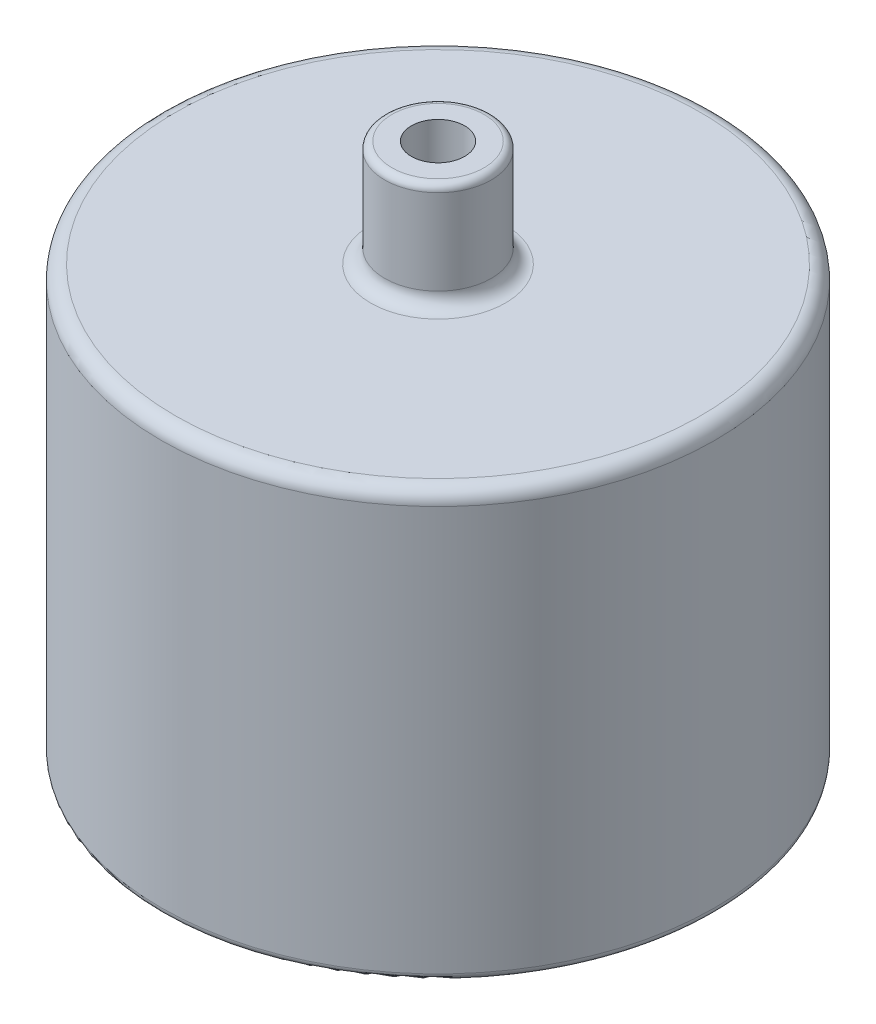
ISO-10303-21;
HEADER;
FILE_DESCRIPTION(('STEP AP214'),'2;1');
FILE_NAME('part.step','',(''),(''),'','','');
FILE_SCHEMA(('AUTOMOTIVE_DESIGN { 1 0 10303 214 1 1 1 1 }'));
ENDSEC;
DATA;
#1=APPLICATION_CONTEXT('core data for automotive mechanical design processes');
#2=APPLICATION_PROTOCOL_DEFINITION('international standard','automotive_design',2000,#1);
#3=PRODUCT_CONTEXT('',#1,'mechanical');
#4=PRODUCT('Part','Part','',(#3));
#5=PRODUCT_RELATED_PRODUCT_CATEGORY('part','',(#4));
#6=PRODUCT_DEFINITION_FORMATION('','',#4);
#7=PRODUCT_DEFINITION_CONTEXT('part definition',#1,'design');
#8=PRODUCT_DEFINITION('design','',#6,#7);
#9=PRODUCT_DEFINITION_SHAPE('','',#8);
#10=(LENGTH_UNIT() NAMED_UNIT(*) SI_UNIT(.MILLI.,.METRE.));
#11=(NAMED_UNIT(*) PLANE_ANGLE_UNIT() SI_UNIT($,.RADIAN.));
#12=(NAMED_UNIT(*) SI_UNIT($,.STERADIAN.) SOLID_ANGLE_UNIT());
#13=UNCERTAINTY_MEASURE_WITH_UNIT(LENGTH_MEASURE(1.E-05),#10,'distance_accuracy_value','');
#14=(GEOMETRIC_REPRESENTATION_CONTEXT(3) GLOBAL_UNCERTAINTY_ASSIGNED_CONTEXT((#13)) GLOBAL_UNIT_ASSIGNED_CONTEXT((#10,
#11,#12)) REPRESENTATION_CONTEXT('',''));
#15=CARTESIAN_POINT('',(0.,0.,0.));
#16=DIRECTION('',(0.,0.,1.));
#17=DIRECTION('',(1.,0.,0.));
#18=AXIS2_PLACEMENT_3D('',#15,#16,#17);
#19=CARTESIAN_POINT('',(0.,76.2,0.));
#20=DIRECTION('',(0.,-1.,0.));
#21=DIRECTION('',(0.,0.,-1.));
#22=AXIS2_PLACEMENT_3D('',#19,#20,#21);
#23=CYLINDRICAL_SURFACE('',#22,49.53);
#24=CARTESIAN_POINT('',(0.,1.26999999999999,0.));
#25=DIRECTION('',(0.,1.,0.));
#26=DIRECTION('',(0.,0.,1.));
#27=AXIS2_PLACEMENT_3D('',#24,#25,#26);
#28=CIRCLE('',#27,49.53);
#29=CARTESIAN_POINT('',(0.,1.26999999999999,-49.53));
#30=VERTEX_POINT('',#29);
#31=EDGE_CURVE('E63',#30,#30,#28,.T.);
#32=CARTESIAN_POINT('',(0.,73.66,0.));
#33=DIRECTION('',(0.,1.,0.));
#34=DIRECTION('',(0.,0.,1.));
#35=AXIS2_PLACEMENT_3D('',#32,#33,#34);
#36=CIRCLE('',#35,49.53);
#37=CARTESIAN_POINT('',(0.,73.66,-49.53));
#38=VERTEX_POINT('',#37);
#39=EDGE_CURVE('E69',#38,#38,#36,.F.);
#40=CARTESIAN_POINT('',(0.,1.26999999999999,-49.53));
#41=CARTESIAN_POINT('',(0.,2.02406249999999,-49.53));
#42=CARTESIAN_POINT('',(0.,2.77812499999999,-49.53));
#43=CARTESIAN_POINT('',(0.,4.28624999999999,-49.53));
#44=CARTESIAN_POINT('',(0.,5.04031249999999,-49.53));
#45=CARTESIAN_POINT('',(0.,6.54843749999999,-49.53));
#46=CARTESIAN_POINT('',(0.,7.30249999999999,-49.53));
#47=CARTESIAN_POINT('',(0.,8.81062499999999,-49.53));
#48=CARTESIAN_POINT('',(0.,9.56468749999999,-49.53));
#49=CARTESIAN_POINT('',(0.,11.0728125,-49.53));
#50=CARTESIAN_POINT('',(0.,11.826875,-49.53));
#51=CARTESIAN_POINT('',(0.,13.335,-49.53));
#52=CARTESIAN_POINT('',(0.,14.0890625,-49.53));
#53=CARTESIAN_POINT('',(0.,15.5971875,-49.53));
#54=CARTESIAN_POINT('',(0.,16.35125,-49.53));
#55=CARTESIAN_POINT('',(0.,17.859375,-49.53));
#56=CARTESIAN_POINT('',(0.,18.6134375,-49.53));
#57=CARTESIAN_POINT('',(0.,20.1215625,-49.53));
#58=CARTESIAN_POINT('',(0.,20.875625,-49.53));
#59=CARTESIAN_POINT('',(0.,22.38375,-49.53));
#60=CARTESIAN_POINT('',(0.,23.1378125,-49.53));
#61=CARTESIAN_POINT('',(0.,24.6459375,-49.53));
#62=CARTESIAN_POINT('',(0.,25.4,-49.53));
#63=CARTESIAN_POINT('',(0.,26.908125,-49.53));
#64=CARTESIAN_POINT('',(0.,27.6621875,-49.53));
#65=CARTESIAN_POINT('',(0.,29.1703125,-49.53));
#66=CARTESIAN_POINT('',(0.,29.924375,-49.53));
#67=CARTESIAN_POINT('',(0.,31.4325,-49.53));
#68=CARTESIAN_POINT('',(0.,32.1865625,-49.53));
#69=CARTESIAN_POINT('',(0.,33.6946875,-49.53));
#70=CARTESIAN_POINT('',(0.,34.44875,-49.53));
#71=CARTESIAN_POINT('',(0.,35.956875,-49.53));
#72=CARTESIAN_POINT('',(0.,36.7109375,-49.53));
#73=CARTESIAN_POINT('',(0.,38.2190625,-49.53));
#74=CARTESIAN_POINT('',(0.,38.973125,-49.53));
#75=CARTESIAN_POINT('',(0.,40.48125,-49.53));
#76=CARTESIAN_POINT('',(0.,41.2353125,-49.53));
#77=CARTESIAN_POINT('',(0.,42.7434375,-49.53));
#78=CARTESIAN_POINT('',(0.,43.4975,-49.53));
#79=CARTESIAN_POINT('',(0.,45.005625,-49.53));
#80=CARTESIAN_POINT('',(0.,45.7596875,-49.53));
#81=CARTESIAN_POINT('',(0.,47.2678125,-49.53));
#82=CARTESIAN_POINT('',(0.,48.021875,-49.53));
#83=CARTESIAN_POINT('',(0.,49.53,-49.53));
#84=CARTESIAN_POINT('',(0.,50.2840625,-49.53));
#85=CARTESIAN_POINT('',(0.,51.7921875,-49.53));
#86=CARTESIAN_POINT('',(0.,52.54625,-49.53));
#87=CARTESIAN_POINT('',(0.,54.054375,-49.53));
#88=CARTESIAN_POINT('',(0.,54.8084375,-49.53));
#89=CARTESIAN_POINT('',(0.,56.3165625,-49.53));
#90=CARTESIAN_POINT('',(0.,57.070625,-49.53));
#91=CARTESIAN_POINT('',(0.,58.57875,-49.53));
#92=CARTESIAN_POINT('',(0.,59.3328125,-49.53));
#93=CARTESIAN_POINT('',(0.,60.8409375,-49.53));
#94=CARTESIAN_POINT('',(0.,61.595,-49.53));
#95=CARTESIAN_POINT('',(0.,63.103125,-49.53));
#96=CARTESIAN_POINT('',(0.,63.8571875,-49.53));
#97=CARTESIAN_POINT('',(0.,65.3653125,-49.53));
#98=CARTESIAN_POINT('',(0.,66.119375,-49.53));
#99=CARTESIAN_POINT('',(0.,67.6275,-49.53));
#100=CARTESIAN_POINT('',(0.,68.3815625,-49.53));
#101=CARTESIAN_POINT('',(0.,69.8896875,-49.53));
#102=CARTESIAN_POINT('',(0.,70.64375,-49.53));
#103=CARTESIAN_POINT('',(0.,72.151875,-49.53));
#104=CARTESIAN_POINT('',(0.,72.9059375,-49.53));
#105=CARTESIAN_POINT('',(0.,73.66,-49.53));
#106=B_SPLINE_CURVE_WITH_KNOTS('',3,(#40,#41,#42,#43,#44,#45,#46,#47,#48,#49,#50,#51,#52,#53,
#54,#55,#56,#57,#58,#59,#60,#61,#62,#63,#64,#65,#66,#67,#68,#69,#70,#71,#72,#73,#74,#75,#76,#77,
#78,#79,#80,#81,#82,#83,#84,#85,#86,#87,#88,#89,#90,#91,#92,#93,#94,#95,#96,#97,#98,#99,#100,
#101,#102,#103,#104,#105),.UNSPECIFIED.,.F.,.F.,(4,2,2,2,2,2,2,2,2,2,2,2,2,2,2,2,2,2,2,2,2,2,2,
2,2,2,2,2,2,2,2,2,4),(0.,2.2621875,4.524375,6.7865625,9.04874999999999,11.3109375,13.573125,
15.8353125,18.0975,20.3596875,22.621875,24.8840625,27.14625,29.4084375,31.670625,33.9328125,
36.195,38.4571875,40.719375,42.9815625,45.24375,47.5059375,49.768125,52.0303125,54.2925,
56.5546875,58.816875,61.0790625,63.34125,65.6034375,67.865625,70.1278125,72.39),.UNSPECIFIED.);
#107=EDGE_CURVE('BSEAM34',#30,#38,#106,.T.);
#108=ORIENTED_EDGE('',*,*,#31,.T.);
#109=ORIENTED_EDGE('',*,*,#39,.T.);
#110=ORIENTED_EDGE('',*,*,#107,.T.);
#111=ORIENTED_EDGE('',*,*,#107,.F.);
#112=EDGE_LOOP('',(#108,#110,#109,#111));
#113=FACE_BOUND('',#112,.T.);
#114=ADVANCED_FACE('F34',(#113),#23,.T.);
#115=CARTESIAN_POINT('',(0.,76.2,0.));
#116=DIRECTION('',(0.,1.,0.));
#117=DIRECTION('',(0.,0.,1.));
#118=AXIS2_PLACEMENT_3D('',#115,#116,#117);
#119=PLANE('',#118);
#120=CARTESIAN_POINT('',(0.,76.2,0.));
#121=DIRECTION('',(0.,1.,0.));
#122=DIRECTION('',(0.,0.,1.));
#123=AXIS2_PLACEMENT_3D('',#120,#121,#122);
#124=CIRCLE('',#123,46.99);
#125=CARTESIAN_POINT('',(0.,76.2,46.99));
#126=VERTEX_POINT('',#125);
#127=EDGE_CURVE('E72',#126,#126,#124,.T.);
#128=ORIENTED_EDGE('',*,*,#127,.T.);
#129=EDGE_LOOP('',(#128));
#130=FACE_BOUND('',#129,.T.);
#131=CARTESIAN_POINT('',(0.,76.2,0.));
#132=DIRECTION('',(0.,1.,0.));
#133=DIRECTION('',(0.,0.,1.));
#134=AXIS2_PLACEMENT_3D('',#131,#132,#133);
#135=CIRCLE('',#134,12.065);
#136=CARTESIAN_POINT('',(0.,76.2,12.065));
#137=VERTEX_POINT('',#136);
#138=EDGE_CURVE('E75',#137,#137,#135,.F.);
#139=ORIENTED_EDGE('',*,*,#138,.T.);
#140=EDGE_LOOP('',(#139));
#141=FACE_BOUND('',#140,.T.);
#142=ADVANCED_FACE('F103',(#130,#141),#119,.T.);
#143=CARTESIAN_POINT('',(0.,0.,0.));
#144=DIRECTION('',(0.,1.,0.));
#145=DIRECTION('',(0.,0.,1.));
#146=AXIS2_PLACEMENT_3D('',#143,#144,#145);
#147=PLANE('',#146);
#148=CARTESIAN_POINT('',(0.,0.,0.));
#149=DIRECTION('',(0.,1.,0.));
#150=DIRECTION('',(0.,0.,1.));
#151=AXIS2_PLACEMENT_3D('',#148,#149,#150);
#152=CIRCLE('',#151,48.26);
#153=CARTESIAN_POINT('',(0.,0.,48.26));
#154=VERTEX_POINT('',#153);
#155=EDGE_CURVE('E60',#154,#154,#152,.F.);
#156=ORIENTED_EDGE('',*,*,#155,.T.);
#157=EDGE_LOOP('',(#156));
#158=FACE_BOUND('',#157,.T.);
#159=CARTESIAN_POINT('',(0.,0.,0.));
#160=DIRECTION('',(0.,-1.,0.));
#161=DIRECTION('',(0.,0.,-1.));
#162=AXIS2_PLACEMENT_3D('',#159,#160,#161);
#163=CIRCLE('',#162,46.355);
#164=CARTESIAN_POINT('',(0.,0.,-46.355));
#165=VERTEX_POINT('',#164);
#166=EDGE_CURVE('E78',#165,#165,#163,.T.);
#167=ORIENTED_EDGE('',*,*,#166,.F.);
#168=EDGE_LOOP('',(#167));
#169=FACE_BOUND('',#168,.T.);
#170=ADVANCED_FACE('F109',(#158,#169),#147,.F.);
#171=CARTESIAN_POINT('',(0.,69.85,0.));
#172=DIRECTION('',(0.,1.,0.));
#173=DIRECTION('',(0.,0.,1.));
#174=AXIS2_PLACEMENT_3D('',#171,#172,#173);
#175=PLANE('',#174);
#176=CARTESIAN_POINT('',(0.,69.85,0.));
#177=DIRECTION('',(0.,1.,0.));
#178=DIRECTION('',(0.,0.,1.));
#179=AXIS2_PLACEMENT_3D('',#176,#177,#178);
#180=CIRCLE('',#179,6.0325);
#181=CARTESIAN_POINT('',(0.,69.85,6.0325));
#182=VERTEX_POINT('',#181);
#183=EDGE_CURVE('E41',#182,#182,#180,.T.);
#184=ORIENTED_EDGE('',*,*,#183,.T.);
#185=EDGE_LOOP('',(#184));
#186=FACE_BOUND('',#185,.T.);
#187=CARTESIAN_POINT('',(0.,69.85,0.));
#188=DIRECTION('',(0.,1.,0.));
#189=DIRECTION('',(0.,0.,1.));
#190=AXIS2_PLACEMENT_3D('',#187,#188,#189);
#191=CIRCLE('',#190,45.085);
#192=CARTESIAN_POINT('',(0.,69.85,45.085));
#193=VERTEX_POINT('',#192);
#194=EDGE_CURVE('E45',#193,#193,#191,.F.);
#195=ORIENTED_EDGE('',*,*,#194,.T.);
#196=EDGE_LOOP('',(#195));
#197=FACE_BOUND('',#196,.T.);
#198=ADVANCED_FACE('F143',(#186,#197),#175,.F.);
#199=CARTESIAN_POINT('',(0.,207.31173936761,0.));
#200=DIRECTION('',(0.,-1.,0.));
#201=DIRECTION('',(0.,0.,-1.));
#202=AXIS2_PLACEMENT_3D('',#199,#200,#201);
#203=CYLINDRICAL_SURFACE('',#202,46.355);
#204=CARTESIAN_POINT('',(0.,68.58,0.));
#205=DIRECTION('',(0.,1.,0.));
#206=DIRECTION('',(0.,0.,1.));
#207=AXIS2_PLACEMENT_3D('',#204,#205,#206);
#208=CIRCLE('',#207,46.355);
#209=CARTESIAN_POINT('',(0.,68.58,46.355));
#210=VERTEX_POINT('',#209);
#211=EDGE_CURVE('E11',#210,#210,#208,.T.);
#212=ORIENTED_EDGE('',*,*,#211,.T.);
#213=EDGE_LOOP('',(#212));
#214=FACE_BOUND('',#213,.T.);
#215=ORIENTED_EDGE('',*,*,#166,.T.);
#216=EDGE_LOOP('',(#215));
#217=FACE_BOUND('',#216,.T.);
#218=ADVANCED_FACE('F99',(#214,#217),#203,.F.);
#219=CARTESIAN_POINT('',(0.,95.25,0.));
#220=DIRECTION('',(0.,-1.,0.));
#221=DIRECTION('',(0.,0.,-1.));
#222=AXIS2_PLACEMENT_3D('',#219,#220,#221);
#223=CYLINDRICAL_SURFACE('',#222,9.525);
#224=CARTESIAN_POINT('',(0.,93.98,0.));
#225=DIRECTION('',(0.,1.,0.));
#226=DIRECTION('',(0.,0.,1.));
#227=AXIS2_PLACEMENT_3D('',#224,#225,#226);
#228=CIRCLE('',#227,9.525);
#229=CARTESIAN_POINT('',(0.,93.98,-9.525));
#230=VERTEX_POINT('',#229);
#231=EDGE_CURVE('E54',#230,#230,#228,.F.);
#232=CARTESIAN_POINT('',(0.,78.74,0.));
#233=DIRECTION('',(0.,1.,0.));
#234=DIRECTION('',(0.,0.,1.));
#235=AXIS2_PLACEMENT_3D('',#232,#233,#234);
#236=CIRCLE('',#235,9.525);
#237=CARTESIAN_POINT('',(0.,78.74,-9.525));
#238=VERTEX_POINT('',#237);
#239=EDGE_CURVE('E66',#238,#238,#236,.T.);
#240=CARTESIAN_POINT('',(0.,93.98,-9.525));
#241=CARTESIAN_POINT('',(0.,93.82125,-9.525));
#242=CARTESIAN_POINT('',(0.,93.6625,-9.525));
#243=CARTESIAN_POINT('',(0.,93.345,-9.525));
#244=CARTESIAN_POINT('',(0.,93.18625,-9.525));
#245=CARTESIAN_POINT('',(0.,92.86875,-9.525));
#246=CARTESIAN_POINT('',(0.,92.71,-9.525));
#247=CARTESIAN_POINT('',(0.,92.3925,-9.525));
#248=CARTESIAN_POINT('',(0.,92.23375,-9.525));
#249=CARTESIAN_POINT('',(0.,91.91625,-9.525));
#250=CARTESIAN_POINT('',(0.,91.7575,-9.525));
#251=CARTESIAN_POINT('',(0.,91.44,-9.525));
#252=CARTESIAN_POINT('',(0.,91.28125,-9.525));
#253=CARTESIAN_POINT('',(0.,90.96375,-9.525));
#254=CARTESIAN_POINT('',(0.,90.805,-9.525));
#255=CARTESIAN_POINT('',(0.,90.4875,-9.525));
#256=CARTESIAN_POINT('',(0.,90.32875,-9.525));
#257=CARTESIAN_POINT('',(0.,90.01125,-9.525));
#258=CARTESIAN_POINT('',(0.,89.8525,-9.525));
#259=CARTESIAN_POINT('',(0.,89.535,-9.525));
#260=CARTESIAN_POINT('',(0.,89.37625,-9.525));
#261=CARTESIAN_POINT('',(0.,89.05875,-9.525));
#262=CARTESIAN_POINT('',(0.,88.9,-9.525));
#263=CARTESIAN_POINT('',(0.,88.5825,-9.525));
#264=CARTESIAN_POINT('',(0.,88.42375,-9.525));
#265=CARTESIAN_POINT('',(0.,88.10625,-9.525));
#266=CARTESIAN_POINT('',(0.,87.9475,-9.525));
#267=CARTESIAN_POINT('',(0.,87.63,-9.525));
#268=CARTESIAN_POINT('',(0.,87.47125,-9.525));
#269=CARTESIAN_POINT('',(0.,87.15375,-9.525));
#270=CARTESIAN_POINT('',(0.,86.995,-9.525));
#271=CARTESIAN_POINT('',(0.,86.6775,-9.525));
#272=CARTESIAN_POINT('',(0.,86.51875,-9.525));
#273=CARTESIAN_POINT('',(0.,86.20125,-9.525));
#274=CARTESIAN_POINT('',(0.,86.0425,-9.525));
#275=CARTESIAN_POINT('',(0.,85.725,-9.525));
#276=CARTESIAN_POINT('',(0.,85.56625,-9.525));
#277=CARTESIAN_POINT('',(0.,85.24875,-9.525));
#278=CARTESIAN_POINT('',(0.,85.09,-9.525));
#279=CARTESIAN_POINT('',(0.,84.7725,-9.525));
#280=CARTESIAN_POINT('',(0.,84.61375,-9.525));
#281=CARTESIAN_POINT('',(0.,84.29625,-9.525));
#282=CARTESIAN_POINT('',(0.,84.1375,-9.525));
#283=CARTESIAN_POINT('',(0.,83.82,-9.525));
#284=CARTESIAN_POINT('',(0.,83.66125,-9.525));
#285=CARTESIAN_POINT('',(0.,83.34375,-9.525));
#286=CARTESIAN_POINT('',(0.,83.185,-9.525));
#287=CARTESIAN_POINT('',(0.,82.8675,-9.525));
#288=CARTESIAN_POINT('',(0.,82.70875,-9.525));
#289=CARTESIAN_POINT('',(0.,82.39125,-9.525));
#290=CARTESIAN_POINT('',(0.,82.2325,-9.525));
#291=CARTESIAN_POINT('',(0.,81.915,-9.525));
#292=CARTESIAN_POINT('',(0.,81.75625,-9.525));
#293=CARTESIAN_POINT('',(0.,81.43875,-9.525));
#294=CARTESIAN_POINT('',(0.,81.28,-9.525));
#295=CARTESIAN_POINT('',(0.,80.9625,-9.525));
#296=CARTESIAN_POINT('',(0.,80.80375,-9.525));
#297=CARTESIAN_POINT('',(0.,80.48625,-9.525));
#298=CARTESIAN_POINT('',(0.,80.3275,-9.525));
#299=CARTESIAN_POINT('',(0.,80.01,-9.525));
#300=CARTESIAN_POINT('',(0.,79.85125,-9.525));
#301=CARTESIAN_POINT('',(0.,79.53375,-9.525));
#302=CARTESIAN_POINT('',(0.,79.375,-9.525));
#303=CARTESIAN_POINT('',(0.,79.0575,-9.525));
#304=CARTESIAN_POINT('',(0.,78.89875,-9.525));
#305=CARTESIAN_POINT('',(0.,78.74,-9.525));
#306=B_SPLINE_CURVE_WITH_KNOTS('',3,(#240,#241,#242,#243,#244,#245,#246,#247,#248,#249,#250,
#251,#252,#253,#254,#255,#256,#257,#258,#259,#260,#261,#262,#263,#264,#265,#266,#267,#268,#269,
#270,#271,#272,#273,#274,#275,#276,#277,#278,#279,#280,#281,#282,#283,#284,#285,#286,#287,#288,
#289,#290,#291,#292,#293,#294,#295,#296,#297,#298,#299,#300,#301,#302,#303,#304,#305),
.UNSPECIFIED.,.F.,.F.,(4,2,2,2,2,2,2,2,2,2,2,2,2,2,2,2,2,2,2,2,2,2,2,2,2,2,2,2,2,2,2,2,4),(0.,
0.476249999999998,0.952499999999995,1.42874999999999,1.90499999999999,2.38124999999999,2.8575,
3.33375,3.80999999999999,4.28624999999999,4.76249999999999,5.23875,5.715,6.19125,
6.66749999999999,7.14374999999999,7.62,8.09625,8.5725,9.04874999999999,9.52499999999999,
10.00125,10.4775,10.95375,11.43,11.90625,12.3825,12.85875,13.335,13.81125,14.2875,14.76375,
15.24),.UNSPECIFIED.);
#307=EDGE_CURVE('BSEAM89',#230,#238,#306,.T.);
#308=ORIENTED_EDGE('',*,*,#231,.T.);
#309=ORIENTED_EDGE('',*,*,#239,.T.);
#310=ORIENTED_EDGE('',*,*,#307,.T.);
#311=ORIENTED_EDGE('',*,*,#307,.F.);
#312=EDGE_LOOP('',(#308,#310,#309,#311));
#313=FACE_BOUND('',#312,.T.);
#314=ADVANCED_FACE('F89',(#313),#223,.T.);
#315=CARTESIAN_POINT('',(0.,95.25,0.));
#316=DIRECTION('',(0.,1.,0.));
#317=DIRECTION('',(0.,0.,1.));
#318=AXIS2_PLACEMENT_3D('',#315,#316,#317);
#319=PLANE('',#318);
#320=CARTESIAN_POINT('',(0.,95.25,0.));
#321=DIRECTION('',(0.,1.,0.));
#322=DIRECTION('',(0.,0.,1.));
#323=AXIS2_PLACEMENT_3D('',#320,#321,#322);
#324=CIRCLE('',#323,8.255);
#325=CARTESIAN_POINT('',(0.,95.25,8.255));
#326=VERTEX_POINT('',#325);
#327=EDGE_CURVE('E57',#326,#326,#324,.T.);
#328=ORIENTED_EDGE('',*,*,#327,.T.);
#329=EDGE_LOOP('',(#328));
#330=FACE_BOUND('',#329,.T.);
#331=CARTESIAN_POINT('',(0.,95.25,0.));
#332=DIRECTION('',(0.,1.,0.));
#333=DIRECTION('',(0.,0.,1.));
#334=AXIS2_PLACEMENT_3D('',#331,#332,#333);
#335=CIRCLE('',#334,4.7625);
#336=CARTESIAN_POINT('',(0.,95.25,4.7625));
#337=VERTEX_POINT('',#336);
#338=EDGE_CURVE('E81',#337,#337,#335,.T.);
#339=ORIENTED_EDGE('',*,*,#338,.F.);
#340=EDGE_LOOP('',(#339));
#341=FACE_BOUND('',#340,.T.);
#342=ADVANCED_FACE('F87',(#330,#341),#319,.T.);
#343=CARTESIAN_POINT('',(0.,-0.001000000000001,0.));
#344=DIRECTION('',(0.,1.,0.));
#345=DIRECTION('',(0.,0.,1.));
#346=AXIS2_PLACEMENT_3D('',#343,#344,#345);
#347=CYLINDRICAL_SURFACE('',#346,4.7625);
#348=CARTESIAN_POINT('',(0.,71.12,0.));
#349=DIRECTION('',(0.,1.,0.));
#350=DIRECTION('',(0.,0.,1.));
#351=AXIS2_PLACEMENT_3D('',#348,#349,#350);
#352=CIRCLE('',#351,4.7625);
#353=CARTESIAN_POINT('',(0.,71.12,4.7625));
#354=VERTEX_POINT('',#353);
#355=EDGE_CURVE('E49',#354,#354,#352,.F.);
#356=ORIENTED_EDGE('',*,*,#355,.T.);
#357=EDGE_LOOP('',(#356));
#358=FACE_BOUND('',#357,.T.);
#359=ORIENTED_EDGE('',*,*,#338,.T.);
#360=EDGE_LOOP('',(#359));
#361=FACE_BOUND('',#360,.T.);
#362=ADVANCED_FACE('F85',(#358,#361),#347,.F.);
#363=CARTESIAN_POINT('',(0.,73.66,0.));
#364=DIRECTION('',(0.,1.,0.));
#365=DIRECTION('',(0.,0.,1.));
#366=AXIS2_PLACEMENT_3D('',#363,#364,#365);
#367=TOROIDAL_SURFACE('',#366,46.99,2.54);
#368=ORIENTED_EDGE('',*,*,#39,.F.);
#369=EDGE_LOOP('',(#368));
#370=FACE_BOUND('',#369,.T.);
#371=ORIENTED_EDGE('',*,*,#127,.F.);
#372=EDGE_LOOP('',(#371));
#373=FACE_BOUND('',#372,.T.);
#374=ADVANCED_FACE('F96',(#370,#373),#367,.T.);
#375=CARTESIAN_POINT('',(0.,78.74,0.));
#376=DIRECTION('',(0.,1.,0.));
#377=DIRECTION('',(0.,0.,1.));
#378=AXIS2_PLACEMENT_3D('',#375,#376,#377);
#379=TOROIDAL_SURFACE('',#378,12.065,2.54);
#380=ORIENTED_EDGE('',*,*,#138,.F.);
#381=EDGE_LOOP('',(#380));
#382=FACE_BOUND('',#381,.T.);
#383=ORIENTED_EDGE('',*,*,#239,.F.);
#384=EDGE_LOOP('',(#383));
#385=FACE_BOUND('',#384,.T.);
#386=ADVANCED_FACE('F117',(#382,#385),#379,.F.);
#387=CARTESIAN_POINT('',(0.,1.26999999999999,0.));
#388=DIRECTION('',(0.,1.,0.));
#389=DIRECTION('',(0.,0.,1.));
#390=AXIS2_PLACEMENT_3D('',#387,#388,#389);
#391=TOROIDAL_SURFACE('',#390,48.26,1.27);
#392=ORIENTED_EDGE('',*,*,#155,.F.);
#393=EDGE_LOOP('',(#392));
#394=FACE_BOUND('',#393,.T.);
#395=ORIENTED_EDGE('',*,*,#31,.F.);
#396=EDGE_LOOP('',(#395));
#397=FACE_BOUND('',#396,.T.);
#398=ADVANCED_FACE('F121',(#394,#397),#391,.T.);
#399=CARTESIAN_POINT('',(0.,93.98,0.));
#400=DIRECTION('',(0.,1.,0.));
#401=DIRECTION('',(0.,0.,1.));
#402=AXIS2_PLACEMENT_3D('',#399,#400,#401);
#403=TOROIDAL_SURFACE('',#402,8.255,1.27);
#404=ORIENTED_EDGE('',*,*,#231,.F.);
#405=EDGE_LOOP('',(#404));
#406=FACE_BOUND('',#405,.T.);
#407=ORIENTED_EDGE('',*,*,#327,.F.);
#408=EDGE_LOOP('',(#407));
#409=FACE_BOUND('',#408,.T.);
#410=ADVANCED_FACE('F125',(#406,#409),#403,.T.);
#411=CARTESIAN_POINT('',(0.,71.12,0.));
#412=DIRECTION('',(0.,1.,0.));
#413=DIRECTION('',(0.,0.,1.));
#414=AXIS2_PLACEMENT_3D('',#411,#412,#413);
#415=TOROIDAL_SURFACE('',#414,6.0325,1.27);
#416=ORIENTED_EDGE('',*,*,#183,.F.);
#417=EDGE_LOOP('',(#416));
#418=FACE_BOUND('',#417,.T.);
#419=ORIENTED_EDGE('',*,*,#355,.F.);
#420=EDGE_LOOP('',(#419));
#421=FACE_BOUND('',#420,.T.);
#422=ADVANCED_FACE('F128',(#418,#421),#415,.T.);
#423=CARTESIAN_POINT('',(0.,68.58,0.));
#424=DIRECTION('',(0.,1.,0.));
#425=DIRECTION('',(0.,0.,1.));
#426=AXIS2_PLACEMENT_3D('',#423,#424,#425);
#427=TOROIDAL_SURFACE('',#426,45.085,1.27);
#428=ORIENTED_EDGE('',*,*,#211,.F.);
#429=EDGE_LOOP('',(#428));
#430=FACE_BOUND('',#429,.T.);
#431=ORIENTED_EDGE('',*,*,#194,.F.);
#432=EDGE_LOOP('',(#431));
#433=FACE_BOUND('',#432,.T.);
#434=ADVANCED_FACE('F36',(#430,#433),#427,.F.);
#435=CLOSED_SHELL('',(#114,#142,#170,#198,#218,#314,#342,#362,#374,#386,#398,#410,#422,#434));
#436=MANIFOLD_SOLID_BREP('B2',#435);
#437=ADVANCED_BREP_SHAPE_REPRESENTATION('',(#18,#436),#14);
#438=SHAPE_DEFINITION_REPRESENTATION(#9,#437);
ENDSEC;
END-ISO-10303-21;
